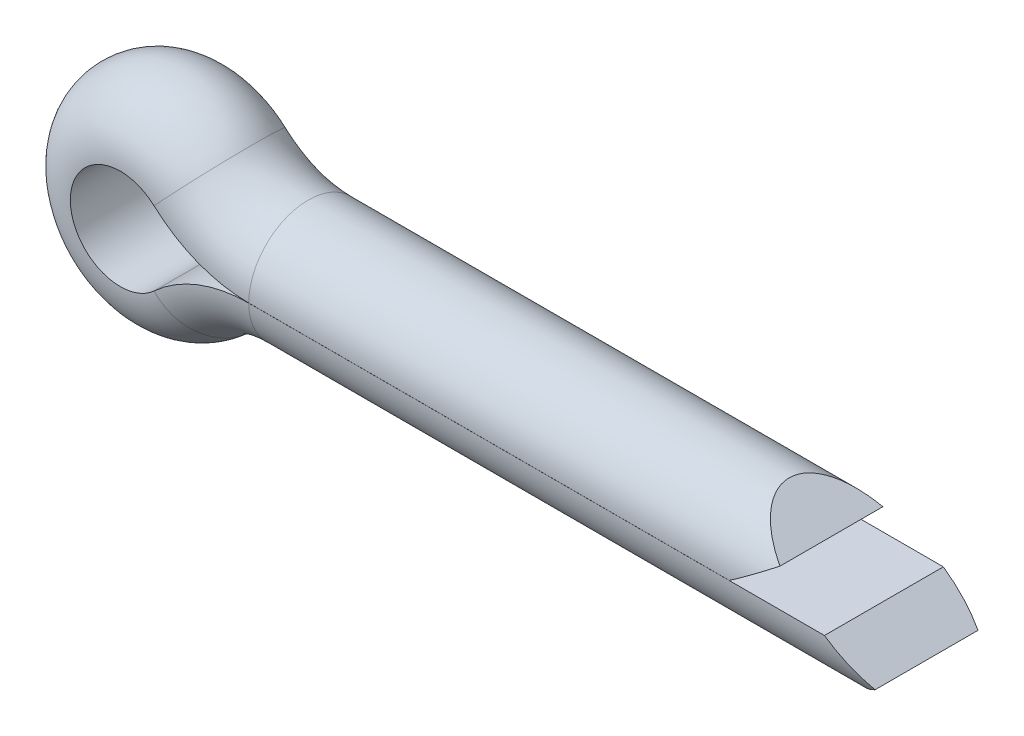
ISO-10303-21;
HEADER;
FILE_DESCRIPTION(('STEP AP214'),'2;1');
FILE_NAME('part.step','',(''),(''),'','','');
FILE_SCHEMA(('AUTOMOTIVE_DESIGN { 1 0 10303 214 1 1 1 1 }'));
ENDSEC;
DATA;
#1=APPLICATION_CONTEXT('core data for automotive mechanical design processes');
#2=APPLICATION_PROTOCOL_DEFINITION('international standard','automotive_design',2000,#1);
#3=PRODUCT_CONTEXT('',#1,'mechanical');
#4=PRODUCT('Part','Part','',(#3));
#5=PRODUCT_RELATED_PRODUCT_CATEGORY('part','',(#4));
#6=PRODUCT_DEFINITION_FORMATION('','',#4);
#7=PRODUCT_DEFINITION_CONTEXT('part definition',#1,'design');
#8=PRODUCT_DEFINITION('design','',#6,#7);
#9=PRODUCT_DEFINITION_SHAPE('','',#8);
#10=(LENGTH_UNIT() NAMED_UNIT(*) SI_UNIT(.MILLI.,.METRE.));
#11=(NAMED_UNIT(*) PLANE_ANGLE_UNIT() SI_UNIT($,.RADIAN.));
#12=(NAMED_UNIT(*) SI_UNIT($,.STERADIAN.) SOLID_ANGLE_UNIT());
#13=UNCERTAINTY_MEASURE_WITH_UNIT(LENGTH_MEASURE(1.E-05),#10,'distance_accuracy_value','');
#14=(GEOMETRIC_REPRESENTATION_CONTEXT(3) GLOBAL_UNCERTAINTY_ASSIGNED_CONTEXT((#13)) GLOBAL_UNIT_ASSIGNED_CONTEXT((#10,
#11,#12)) REPRESENTATION_CONTEXT('',''));
#15=CARTESIAN_POINT('',(0.,0.,0.));
#16=DIRECTION('',(0.,0.,1.));
#17=DIRECTION('',(1.,0.,0.));
#18=AXIS2_PLACEMENT_3D('',#15,#16,#17);
#19=CARTESIAN_POINT('',(0.,-0.00199999999999831,2.49999919999987));
#20=DIRECTION('',(0.,-1.,0.));
#21=DIRECTION('',(1.,0.,0.));
#22=AXIS2_PLACEMENT_3D('',#19,#20,#21);
#23=PLANE('',#22);
#24=DIRECTION('',(1.,0.,0.));
#25=VECTOR('',#24,1.);
#26=CARTESIAN_POINT('',(0.,-0.00199999999999831,2.49999919999987));
#27=LINE('',#26,#25);
#28=CARTESIAN_POINT('',(0.,-0.00199999999999831,2.49999919999987));
#29=VERTEX_POINT('',#28);
#30=CARTESIAN_POINT('',(24.2077433279864,-0.00200000000000005,2.49999919999987));
#31=VERTEX_POINT('',#30);
#32=EDGE_CURVE('E48',#29,#31,#27,.T.);
#33=ORIENTED_EDGE('',*,*,#32,.T.);
#34=DIRECTION('',(0.,0.,-1.));
#35=VECTOR('',#34,1.);
#36=CARTESIAN_POINT('',(24.2077433279864,-0.00199999999999993,2.49999919999987));
#37=LINE('',#36,#35);
#38=CARTESIAN_POINT('',(24.2077433279864,-0.00200000000000005,-2.49999919999987));
#39=VERTEX_POINT('',#38);
#40=EDGE_CURVE('E104',#31,#39,#37,.T.);
#41=ORIENTED_EDGE('',*,*,#40,.T.);
#42=DIRECTION('',(1.,0.,0.));
#43=VECTOR('',#42,1.);
#44=CARTESIAN_POINT('',(0.,-0.00199999999999831,-2.49999919999987));
#45=LINE('',#44,#43);
#46=CARTESIAN_POINT('',(0.,-0.00199999999999831,-2.49999919999987));
#47=VERTEX_POINT('',#46);
#48=EDGE_CURVE('E11',#47,#39,#45,.T.);
#49=ORIENTED_EDGE('',*,*,#48,.F.);
#50=DIRECTION('',(0.,0.,-1.));
#51=VECTOR('',#50,1.);
#52=CARTESIAN_POINT('',(0.,-0.00199999999999831,2.49999919999987));
#53=LINE('',#52,#51);
#54=EDGE_CURVE('E121',#29,#47,#53,.T.);
#55=ORIENTED_EDGE('',*,*,#54,.F.);
#56=EDGE_LOOP('',(#33,#41,#49,#55));
#57=FACE_BOUND('',#56,.T.);
#58=ADVANCED_FACE('F41',(#57),#23,.F.);
#59=CARTESIAN_POINT('',(0.,0.,0.));
#60=DIRECTION('',(1.,0.,0.));
#61=DIRECTION('',(0.,1.,0.));
#62=AXIS2_PLACEMENT_3D('',#59,#60,#61);
#63=CYLINDRICAL_SURFACE('',#62,2.5);
#64=CARTESIAN_POINT('',(27.7781538306625,0.,0.));
#65=DIRECTION('',(-0.575403135479835,0.817869935674356,0.));
#66=DIRECTION('',(0.817869935674356,0.575403135479835,0.));
#67=AXIS2_PLACEMENT_3D('',#64,#65,#66);
#68=ELLIPSE('',#67,4.34477993922509,2.5);
#69=CARTESIAN_POINT('',(26.,-1.25099999999999,-2.16448585118961));
#70=VERTEX_POINT('',#69);
#71=CARTESIAN_POINT('',(26.0000000000001,-1.251,2.16448585118961));
#72=VERTEX_POINT('',#71);
#73=EDGE_CURVE('E118',#70,#72,#68,.T.);
#74=ORIENTED_EDGE('',*,*,#73,.T.);
#75=CARTESIAN_POINT('',(24.2048734213859,0.,0.));
#76=DIRECTION('',(-0.571746880448987,-0.820430073008573,0.));
#77=DIRECTION('',(0.820430073008573,-0.571746880448987,0.));
#78=AXIS2_PLACEMENT_3D('',#75,#76,#77);
#79=ELLIPSE('',#78,4.37256430334482,2.5);
#80=EDGE_CURVE('E107',#72,#31,#79,.T.);
#81=ORIENTED_EDGE('',*,*,#80,.T.);
#82=ORIENTED_EDGE('',*,*,#32,.F.);
#83=CARTESIAN_POINT('',(0.,0.,0.));
#84=DIRECTION('',(-1.,0.,0.));
#85=DIRECTION('',(0.,0.,-1.));
#86=AXIS2_PLACEMENT_3D('',#83,#84,#85);
#87=CIRCLE('',#86,2.5);
#88=EDGE_CURVE('E131',#47,#29,#87,.T.);
#89=ORIENTED_EDGE('',*,*,#88,.F.);
#90=ORIENTED_EDGE('',*,*,#48,.T.);
#91=EDGE_CURVE('E109',#39,#70,#79,.T.);
#92=ORIENTED_EDGE('',*,*,#91,.T.);
#93=EDGE_LOOP('',(#74,#81,#82,#89,#90,#92));
#94=FACE_BOUND('',#93,.T.);
#95=ADVANCED_FACE('F115',(#94),#63,.T.);
#96=CARTESIAN_POINT('',(0.,-5.89285714285712,0.));
#97=DIRECTION('',(0.,0.,-1.));
#98=DIRECTION('',(-1.,0.,0.));
#99=AXIS2_PLACEMENT_3D('',#96,#97,#98);
#100=CYLINDRICAL_SURFACE('',#99,5.89085714285712);
#101=DIRECTION('',(0.,0.,-1.));
#102=VECTOR('',#101,1.);
#103=CARTESIAN_POINT('',(-3.97988203753349,-1.54973190348524,2.49999919999987));
#104=LINE('',#103,#102);
#105=CARTESIAN_POINT('',(-3.97988203753349,-1.54973190348524,2.49999919999987));
#106=VERTEX_POINT('',#105);
#107=CARTESIAN_POINT('',(-3.97988203753349,-1.54973190348524,-2.49999919999987));
#108=VERTEX_POINT('',#107);
#109=EDGE_CURVE('E140',#106,#108,#104,.T.);
#110=ORIENTED_EDGE('',*,*,#109,.F.);
#111=CARTESIAN_POINT('',(0.,-5.89285714285712,2.49999919999987));
#112=DIRECTION('',(0.,0.,-1.));
#113=DIRECTION('',(-1.,0.,0.));
#114=AXIS2_PLACEMENT_3D('',#111,#112,#113);
#115=CIRCLE('',#114,5.89085714285712);
#116=EDGE_CURVE('E125',#106,#29,#115,.T.);
#117=ORIENTED_EDGE('',*,*,#116,.T.);
#118=ORIENTED_EDGE('',*,*,#54,.T.);
#119=CARTESIAN_POINT('',(0.,-5.89285714285712,-2.49999919999987));
#120=DIRECTION('',(0.,0.,-1.));
#121=DIRECTION('',(-1.,0.,0.));
#122=AXIS2_PLACEMENT_3D('',#119,#120,#121);
#123=CIRCLE('',#122,5.89085714285712);
#124=EDGE_CURVE('E123',#108,#47,#123,.T.);
#125=ORIENTED_EDGE('',*,*,#124,.F.);
#126=EDGE_LOOP('',(#110,#117,#118,#125));
#127=FACE_BOUND('',#126,.T.);
#128=ADVANCED_FACE('F206',(#127),#100,.T.);
#129=CARTESIAN_POINT('',(0.,-5.89285714285712,0.));
#130=DIRECTION('',(0.,0.,-1.));
#131=DIRECTION('',(-1.,0.,0.));
#132=AXIS2_PLACEMENT_3D('',#129,#130,#131);
#133=TOROIDAL_SURFACE('',#132,5.89285714285712,2.5);
#134=CARTESIAN_POINT('',(-3.98123324396781,-1.54825737265414,0.));
#135=DIRECTION('',(-0.737265415549587,-0.675603217158189,0.));
#136=DIRECTION('',(0.,0.,-1.));
#137=AXIS2_PLACEMENT_3D('',#134,#135,#136);
#138=CIRCLE('',#137,2.5);
#139=EDGE_CURVE('E143',#108,#106,#138,.T.);
#140=ORIENTED_EDGE('',*,*,#139,.F.);
#141=ORIENTED_EDGE('',*,*,#124,.T.);
#142=ORIENTED_EDGE('',*,*,#88,.T.);
#143=ORIENTED_EDGE('',*,*,#116,.F.);
#144=EDGE_LOOP('',(#140,#141,#142,#143));
#145=FACE_BOUND('',#144,.T.);
#146=ADVANCED_FACE('F208',(#145),#133,.T.);
#147=CARTESIAN_POINT('',(-5.4,0.,0.));
#148=DIRECTION('',(0.,0.,1.));
#149=DIRECTION('',(1.,0.,0.));
#150=AXIS2_PLACEMENT_3D('',#147,#148,#149);
#151=CYLINDRICAL_SURFACE('',#150,2.102);
#152=DIRECTION('',(0.,0.,-1.));
#153=VECTOR('',#152,1.);
#154=CARTESIAN_POINT('',(-3.9798820375335,1.54973190348525,2.49999919999987));
#155=LINE('',#154,#153);
#156=CARTESIAN_POINT('',(-3.9798820375335,1.54973190348525,2.49999919999987));
#157=VERTEX_POINT('',#156);
#158=CARTESIAN_POINT('',(-3.9798820375335,1.54973190348525,-2.49999919999987));
#159=VERTEX_POINT('',#158);
#160=EDGE_CURVE('E152',#157,#159,#155,.T.);
#161=ORIENTED_EDGE('',*,*,#160,.F.);
#162=CARTESIAN_POINT('',(-5.4,0.,2.49999919999987));
#163=DIRECTION('',(0.,0.,1.));
#164=DIRECTION('',(1.,0.,0.));
#165=AXIS2_PLACEMENT_3D('',#162,#163,#164);
#166=CIRCLE('',#165,2.102);
#167=EDGE_CURVE('E137',#157,#106,#166,.T.);
#168=ORIENTED_EDGE('',*,*,#167,.T.);
#169=ORIENTED_EDGE('',*,*,#109,.T.);
#170=CARTESIAN_POINT('',(-5.4,0.,-2.49999919999987));
#171=DIRECTION('',(0.,0.,1.));
#172=DIRECTION('',(1.,0.,0.));
#173=AXIS2_PLACEMENT_3D('',#170,#171,#172);
#174=CIRCLE('',#173,2.102);
#175=EDGE_CURVE('E134',#159,#108,#174,.T.);
#176=ORIENTED_EDGE('',*,*,#175,.F.);
#177=EDGE_LOOP('',(#161,#168,#169,#176));
#178=FACE_BOUND('',#177,.T.);
#179=ADVANCED_FACE('F203',(#178),#151,.F.);
#180=CARTESIAN_POINT('',(-5.4,0.,0.));
#181=DIRECTION('',(0.,0.,1.));
#182=DIRECTION('',(1.,0.,0.));
#183=AXIS2_PLACEMENT_3D('',#180,#181,#182);
#184=DEGENERATE_TOROIDAL_SURFACE('',#183,2.1,2.5,.T.);
#185=CARTESIAN_POINT('',(-3.98123324396782,1.54825737265415,0.));
#186=DIRECTION('',(0.737265415549597,-0.675603217158178,0.));
#187=DIRECTION('',(0.,0.,-1.));
#188=AXIS2_PLACEMENT_3D('',#185,#186,#187);
#189=CIRCLE('',#188,2.5);
#190=EDGE_CURVE('E155',#159,#157,#189,.T.);
#191=ORIENTED_EDGE('',*,*,#190,.F.);
#192=ORIENTED_EDGE('',*,*,#175,.T.);
#193=ORIENTED_EDGE('',*,*,#139,.T.);
#194=ORIENTED_EDGE('',*,*,#167,.F.);
#195=EDGE_LOOP('',(#191,#192,#193,#194));
#196=FACE_BOUND('',#195,.T.);
#197=ADVANCED_FACE('F200',(#196),#184,.T.);
#198=CARTESIAN_POINT('',(0.,5.89285714285712,0.));
#199=DIRECTION('',(0.,0.,-1.));
#200=DIRECTION('',(-1.,0.,0.));
#201=AXIS2_PLACEMENT_3D('',#198,#199,#200);
#202=CYLINDRICAL_SURFACE('',#201,5.89085714285712);
#203=DIRECTION('',(0.,0.,-1.));
#204=VECTOR('',#203,1.);
#205=CARTESIAN_POINT('',(0.,0.00199999999999957,2.49999919999987));
#206=LINE('',#205,#204);
#207=CARTESIAN_POINT('',(0.,0.00199999999999957,2.49999919999987));
#208=VERTEX_POINT('',#207);
#209=CARTESIAN_POINT('',(0.,0.00199999999999957,-2.49999919999987));
#210=VERTEX_POINT('',#209);
#211=EDGE_CURVE('E162',#208,#210,#206,.T.);
#212=ORIENTED_EDGE('',*,*,#211,.F.);
#213=CARTESIAN_POINT('',(0.,5.89285714285712,2.49999919999987));
#214=DIRECTION('',(0.,0.,-1.));
#215=DIRECTION('',(-1.,0.,0.));
#216=AXIS2_PLACEMENT_3D('',#213,#214,#215);
#217=CIRCLE('',#216,5.89085714285712);
#218=EDGE_CURVE('E149',#208,#157,#217,.T.);
#219=ORIENTED_EDGE('',*,*,#218,.T.);
#220=ORIENTED_EDGE('',*,*,#160,.T.);
#221=CARTESIAN_POINT('',(0.,5.89285714285712,-2.49999919999987));
#222=DIRECTION('',(0.,0.,-1.));
#223=DIRECTION('',(-1.,0.,0.));
#224=AXIS2_PLACEMENT_3D('',#221,#222,#223);
#225=CIRCLE('',#224,5.89085714285712);
#226=EDGE_CURVE('E146',#210,#159,#225,.T.);
#227=ORIENTED_EDGE('',*,*,#226,.F.);
#228=EDGE_LOOP('',(#212,#219,#220,#227));
#229=FACE_BOUND('',#228,.T.);
#230=ADVANCED_FACE('F194',(#229),#202,.T.);
#231=CARTESIAN_POINT('',(0.,5.89285714285712,0.));
#232=DIRECTION('',(0.,0.,-1.));
#233=DIRECTION('',(-1.,0.,0.));
#234=AXIS2_PLACEMENT_3D('',#231,#232,#233);
#235=TOROIDAL_SURFACE('',#234,5.89285714285712,2.5);
#236=CARTESIAN_POINT('',(0.,0.,0.));
#237=DIRECTION('',(1.,0.,0.));
#238=DIRECTION('',(0.,0.,-1.));
#239=AXIS2_PLACEMENT_3D('',#236,#237,#238);
#240=CIRCLE('',#239,2.5);
#241=EDGE_CURVE('E167',#210,#208,#240,.T.);
#242=ORIENTED_EDGE('',*,*,#241,.F.);
#243=ORIENTED_EDGE('',*,*,#226,.T.);
#244=ORIENTED_EDGE('',*,*,#190,.T.);
#245=ORIENTED_EDGE('',*,*,#218,.F.);
#246=EDGE_LOOP('',(#242,#243,#244,#245));
#247=FACE_BOUND('',#246,.T.);
#248=ADVANCED_FACE('F197',(#247),#235,.T.);
#249=CARTESIAN_POINT('',(0.,0.,0.));
#250=DIRECTION('',(1.,0.,0.));
#251=DIRECTION('',(0.,1.,0.));
#252=AXIS2_PLACEMENT_3D('',#249,#250,#251);
#253=CYLINDRICAL_SURFACE('',#252,2.5);
#254=CARTESIAN_POINT('',(20.2048734213858,0.,0.));
#255=DIRECTION('',(-0.571746880448986,0.820430073008573,0.));
#256=DIRECTION('',(0.820430073008573,0.571746880448986,0.));
#257=AXIS2_PLACEMENT_3D('',#254,#255,#256);
#258=ELLIPSE('',#257,4.37256430334483,2.5);
#259=CARTESIAN_POINT('',(22.,1.251,2.16448585118961));
#260=VERTEX_POINT('',#259);
#261=CARTESIAN_POINT('',(20.2077433279863,0.00199999999999996,2.49999919999987));
#262=VERTEX_POINT('',#261);
#263=EDGE_CURVE('E55',#260,#262,#258,.F.);
#264=ORIENTED_EDGE('',*,*,#263,.F.);
#265=CARTESIAN_POINT('',(23.7781538306624,0.,0.));
#266=DIRECTION('',(-0.575403135479836,-0.817869935674355,0.));
#267=DIRECTION('',(0.817869935674355,-0.575403135479836,0.));
#268=AXIS2_PLACEMENT_3D('',#265,#266,#267);
#269=ELLIPSE('',#268,4.34477993922508,2.5);
#270=CARTESIAN_POINT('',(22.,1.251,-2.16448585118961));
#271=VERTEX_POINT('',#270);
#272=EDGE_CURVE('E176',#271,#260,#269,.F.);
#273=ORIENTED_EDGE('',*,*,#272,.F.);
#274=CARTESIAN_POINT('',(20.2077433279863,0.00199999999999849,-2.49999919999987));
#275=VERTEX_POINT('',#274);
#276=EDGE_CURVE('E172',#275,#271,#258,.F.);
#277=ORIENTED_EDGE('',*,*,#276,.F.);
#278=DIRECTION('',(1.,0.,0.));
#279=VECTOR('',#278,1.);
#280=CARTESIAN_POINT('',(0.,0.00199999999999957,-2.49999919999987));
#281=LINE('',#280,#279);
#282=EDGE_CURVE('E158',#210,#275,#281,.T.);
#283=ORIENTED_EDGE('',*,*,#282,.F.);
#284=ORIENTED_EDGE('',*,*,#241,.T.);
#285=DIRECTION('',(1.,0.,0.));
#286=VECTOR('',#285,1.);
#287=CARTESIAN_POINT('',(0.,0.00199999999999957,2.49999919999987));
#288=LINE('',#287,#286);
#289=EDGE_CURVE('E159',#208,#262,#288,.T.);
#290=ORIENTED_EDGE('',*,*,#289,.T.);
#291=EDGE_LOOP('',(#264,#273,#277,#283,#284,#290));
#292=FACE_BOUND('',#291,.T.);
#293=ADVANCED_FACE('F186',(#292),#253,.T.);
#294=CARTESIAN_POINT('',(0.,0.00199999999999957,2.49999919999987));
#295=DIRECTION('',(0.,-1.,0.));
#296=DIRECTION('',(1.,0.,0.));
#297=AXIS2_PLACEMENT_3D('',#294,#295,#296);
#298=PLANE('',#297);
#299=DIRECTION('',(0.,0.,-1.));
#300=VECTOR('',#299,1.);
#301=CARTESIAN_POINT('',(20.2077433279863,0.00199999999999996,2.49999919999987));
#302=LINE('',#301,#300);
#303=EDGE_CURVE('E174',#262,#275,#302,.T.);
#304=ORIENTED_EDGE('',*,*,#303,.F.);
#305=ORIENTED_EDGE('',*,*,#289,.F.);
#306=ORIENTED_EDGE('',*,*,#211,.T.);
#307=ORIENTED_EDGE('',*,*,#282,.T.);
#308=EDGE_LOOP('',(#304,#305,#306,#307));
#309=FACE_BOUND('',#308,.T.);
#310=ADVANCED_FACE('F191',(#309),#298,.T.);
#311=CARTESIAN_POINT('',(22.,1.251,-2.49999919999987));
#312=DIRECTION('',(-0.571746880448986,0.820430073008573,0.));
#313=DIRECTION('',(-0.820430073008573,-0.571746880448986,0.));
#314=AXIS2_PLACEMENT_3D('',#311,#312,#313);
#315=PLANE('',#314);
#316=ORIENTED_EDGE('',*,*,#263,.T.);
#317=ORIENTED_EDGE('',*,*,#303,.T.);
#318=ORIENTED_EDGE('',*,*,#276,.T.);
#319=DIRECTION('',(0.,0.,1.));
#320=VECTOR('',#319,1.);
#321=CARTESIAN_POINT('',(22.,1.251,-2.49999919999987));
#322=LINE('',#321,#320);
#323=EDGE_CURVE('E178',#271,#260,#322,.T.);
#324=ORIENTED_EDGE('',*,*,#323,.T.);
#325=EDGE_LOOP('',(#316,#317,#318,#324));
#326=FACE_BOUND('',#325,.T.);
#327=ADVANCED_FACE('F181',(#326),#315,.F.);
#328=CARTESIAN_POINT('',(22.,1.251,-2.49999919999987));
#329=DIRECTION('',(-0.575403135479836,-0.817869935674355,0.));
#330=DIRECTION('',(0.817869935674355,-0.575403135479836,0.));
#331=AXIS2_PLACEMENT_3D('',#328,#329,#330);
#332=PLANE('',#331);
#333=ORIENTED_EDGE('',*,*,#272,.T.);
#334=ORIENTED_EDGE('',*,*,#323,.F.);
#335=EDGE_LOOP('',(#333,#334));
#336=FACE_BOUND('',#335,.T.);
#337=ADVANCED_FACE('F305',(#336),#332,.F.);
#338=CARTESIAN_POINT('',(26.0000000000001,-1.251,-2.49999919999987));
#339=DIRECTION('',(-0.575403135479835,0.817869935674356,0.));
#340=DIRECTION('',(-0.817869935674356,-0.575403135479835,0.));
#341=AXIS2_PLACEMENT_3D('',#338,#339,#340);
#342=PLANE('',#341);
#343=DIRECTION('',(0.,0.,1.));
#344=VECTOR('',#343,1.);
#345=CARTESIAN_POINT('',(26.0000000000001,-1.251,-2.49999919999987));
#346=LINE('',#345,#344);
#347=EDGE_CURVE('E63',#70,#72,#346,.T.);
#348=ORIENTED_EDGE('',*,*,#347,.T.);
#349=ORIENTED_EDGE('',*,*,#73,.F.);
#350=EDGE_LOOP('',(#348,#349));
#351=FACE_BOUND('',#350,.T.);
#352=ADVANCED_FACE('F315',(#351),#342,.F.);
#353=CARTESIAN_POINT('',(26.0000000000001,-1.251,-2.49999919999987));
#354=DIRECTION('',(-0.571746880448987,-0.820430073008573,0.));
#355=DIRECTION('',(0.820430073008573,-0.571746880448987,0.));
#356=AXIS2_PLACEMENT_3D('',#353,#354,#355);
#357=PLANE('',#356);
#358=ORIENTED_EDGE('',*,*,#347,.F.);
#359=ORIENTED_EDGE('',*,*,#91,.F.);
#360=ORIENTED_EDGE('',*,*,#40,.F.);
#361=ORIENTED_EDGE('',*,*,#80,.F.);
#362=EDGE_LOOP('',(#358,#359,#360,#361));
#363=FACE_BOUND('',#362,.T.);
#364=ADVANCED_FACE('F106',(#363),#357,.F.);
#365=CLOSED_SHELL('',(#58,#95,#128,#146,#179,#197,#230,#248,#293,#310,#327,#337,#352,#364));
#366=MANIFOLD_SOLID_BREP('B2',#365);
#367=ADVANCED_BREP_SHAPE_REPRESENTATION('',(#18,#366),#14);
#368=SHAPE_DEFINITION_REPRESENTATION(#9,#367);
ENDSEC;
END-ISO-10303-21;
